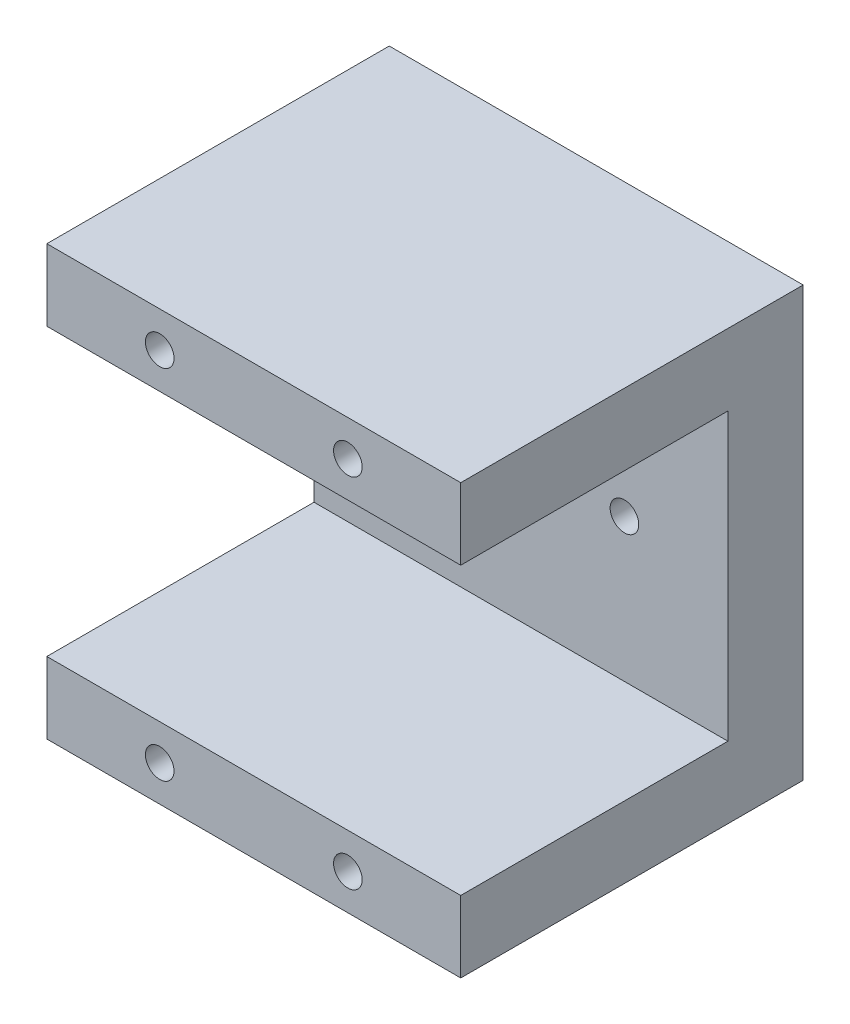
ISO-10303-21;
HEADER;
FILE_DESCRIPTION(('STEP AP214'),'2;1');
FILE_NAME('part.step','',(''),(''),'','','');
FILE_SCHEMA(('AUTOMOTIVE_DESIGN { 1 0 10303 214 1 1 1 1 }'));
ENDSEC;
DATA;
#1=APPLICATION_CONTEXT('core data for automotive mechanical design processes');
#2=APPLICATION_PROTOCOL_DEFINITION('international standard','automotive_design',2000,#1);
#3=PRODUCT_CONTEXT('',#1,'mechanical');
#4=PRODUCT('Part','Part','',(#3));
#5=PRODUCT_RELATED_PRODUCT_CATEGORY('part','',(#4));
#6=PRODUCT_DEFINITION_FORMATION('','',#4);
#7=PRODUCT_DEFINITION_CONTEXT('part definition',#1,'design');
#8=PRODUCT_DEFINITION('design','',#6,#7);
#9=PRODUCT_DEFINITION_SHAPE('','',#8);
#10=(LENGTH_UNIT() NAMED_UNIT(*) SI_UNIT(.MILLI.,.METRE.));
#11=(NAMED_UNIT(*) PLANE_ANGLE_UNIT() SI_UNIT($,.RADIAN.));
#12=(NAMED_UNIT(*) SI_UNIT($,.STERADIAN.) SOLID_ANGLE_UNIT());
#13=UNCERTAINTY_MEASURE_WITH_UNIT(LENGTH_MEASURE(1.E-05),#10,'distance_accuracy_value','');
#14=(GEOMETRIC_REPRESENTATION_CONTEXT(3) GLOBAL_UNCERTAINTY_ASSIGNED_CONTEXT((#13)) GLOBAL_UNIT_ASSIGNED_CONTEXT((#10,
#11,#12)) REPRESENTATION_CONTEXT('',''));
#15=CARTESIAN_POINT('',(0.,0.,0.));
#16=DIRECTION('',(0.,0.,1.));
#17=DIRECTION('',(1.,0.,0.));
#18=AXIS2_PLACEMENT_3D('',#15,#16,#17);
#19=CARTESIAN_POINT('',(0.,0.,45.5));
#20=DIRECTION('',(0.,0.,1.));
#21=DIRECTION('',(1.,0.,0.));
#22=AXIS2_PLACEMENT_3D('',#19,#20,#21);
#23=PLANE('',#22);
#24=CARTESIAN_POINT('',(12.5,23.75,45.5));
#25=DIRECTION('',(0.,0.,1.));
#26=DIRECTION('',(1.,0.,0.));
#27=AXIS2_PLACEMENT_3D('',#24,#25,#26);
#28=CIRCLE('',#27,1.9);
#29=CARTESIAN_POINT('',(14.4,23.75,45.5));
#30=VERTEX_POINT('',#29);
#31=EDGE_CURVE('E406',#30,#30,#28,.T.);
#32=ORIENTED_EDGE('',*,*,#31,.F.);
#33=EDGE_LOOP('',(#32));
#34=FACE_BOUND('',#33,.T.);
#35=CARTESIAN_POINT('',(-12.5,23.75,45.5));
#36=DIRECTION('',(0.,0.,1.));
#37=DIRECTION('',(1.,0.,0.));
#38=AXIS2_PLACEMENT_3D('',#35,#36,#37);
#39=CIRCLE('',#38,1.9);
#40=CARTESIAN_POINT('',(-10.6,23.75,45.5));
#41=VERTEX_POINT('',#40);
#42=EDGE_CURVE('E410',#41,#41,#39,.T.);
#43=ORIENTED_EDGE('',*,*,#42,.F.);
#44=EDGE_LOOP('',(#43));
#45=FACE_BOUND('',#44,.T.);
#46=DIRECTION('',(-1.,0.,0.));
#47=VECTOR('',#46,1.);
#48=CARTESIAN_POINT('',(-27.5,19.,45.5));
#49=LINE('',#48,#47);
#50=CARTESIAN_POINT('',(27.5,19.,45.5));
#51=VERTEX_POINT('',#50);
#52=CARTESIAN_POINT('',(-27.5,19.,45.5));
#53=VERTEX_POINT('',#52);
#54=EDGE_CURVE('E128',#51,#53,#49,.T.);
#55=ORIENTED_EDGE('',*,*,#54,.F.);
#56=DIRECTION('',(0.,1.,0.));
#57=VECTOR('',#56,1.);
#58=CARTESIAN_POINT('',(27.5,28.5,45.5));
#59=LINE('',#58,#57);
#60=CARTESIAN_POINT('',(27.5,28.5,45.5));
#61=VERTEX_POINT('',#60);
#62=EDGE_CURVE('E90',#51,#61,#59,.T.);
#63=ORIENTED_EDGE('',*,*,#62,.T.);
#64=DIRECTION('',(-1.,0.,0.));
#65=VECTOR('',#64,1.);
#66=CARTESIAN_POINT('',(-27.5,28.5,45.5));
#67=LINE('',#66,#65);
#68=CARTESIAN_POINT('',(-27.5,28.5,45.5));
#69=VERTEX_POINT('',#68);
#70=EDGE_CURVE('E142',#61,#69,#67,.T.);
#71=ORIENTED_EDGE('',*,*,#70,.T.);
#72=DIRECTION('',(0.,-1.,0.));
#73=VECTOR('',#72,1.);
#74=CARTESIAN_POINT('',(-27.5,28.5,45.5));
#75=LINE('',#74,#73);
#76=EDGE_CURVE('E144',#69,#53,#75,.T.);
#77=ORIENTED_EDGE('',*,*,#76,.T.);
#78=EDGE_LOOP('',(#55,#63,#71,#77));
#79=FACE_BOUND('',#78,.T.);
#80=ADVANCED_FACE('F37',(#34,#45,#79),#23,.T.);
#81=CARTESIAN_POINT('',(27.5,28.5,45.5));
#82=DIRECTION('',(-1.,0.,0.));
#83=DIRECTION('',(0.,-1.,0.));
#84=AXIS2_PLACEMENT_3D('',#81,#82,#83);
#85=PLANE('',#84);
#86=ORIENTED_EDGE('',*,*,#62,.F.);
#87=DIRECTION('',(0.,0.,1.));
#88=VECTOR('',#87,1.);
#89=CARTESIAN_POINT('',(27.5,19.,10.));
#90=LINE('',#89,#88);
#91=CARTESIAN_POINT('',(27.5,19.,10.));
#92=VERTEX_POINT('',#91);
#93=EDGE_CURVE('E135',#92,#51,#90,.T.);
#94=ORIENTED_EDGE('',*,*,#93,.F.);
#95=DIRECTION('',(0.,1.,0.));
#96=VECTOR('',#95,1.);
#97=CARTESIAN_POINT('',(27.5,19.,10.));
#98=LINE('',#97,#96);
#99=CARTESIAN_POINT('',(27.5,-19.,10.));
#100=VERTEX_POINT('',#99);
#101=EDGE_CURVE('E118',#100,#92,#98,.T.);
#102=ORIENTED_EDGE('',*,*,#101,.F.);
#103=DIRECTION('',(0.,0.,1.));
#104=VECTOR('',#103,1.);
#105=CARTESIAN_POINT('',(27.5,-19.,10.));
#106=LINE('',#105,#104);
#107=CARTESIAN_POINT('',(27.5,-19.,45.5));
#108=VERTEX_POINT('',#107);
#109=EDGE_CURVE('E115',#100,#108,#106,.T.);
#110=ORIENTED_EDGE('',*,*,#109,.T.);
#111=CARTESIAN_POINT('',(27.5,-28.5,45.5));
#112=VERTEX_POINT('',#111);
#113=EDGE_CURVE('E140',#112,#108,#59,.T.);
#114=ORIENTED_EDGE('',*,*,#113,.F.);
#115=DIRECTION('',(0.,0.,-1.));
#116=VECTOR('',#115,1.);
#117=CARTESIAN_POINT('',(27.5,-28.5,45.5));
#118=LINE('',#117,#116);
#119=CARTESIAN_POINT('',(27.5,-28.5,0.));
#120=VERTEX_POINT('',#119);
#121=EDGE_CURVE('E148',#112,#120,#118,.T.);
#122=ORIENTED_EDGE('',*,*,#121,.T.);
#123=DIRECTION('',(0.,1.,0.));
#124=VECTOR('',#123,1.);
#125=CARTESIAN_POINT('',(27.5,28.5,0.));
#126=LINE('',#125,#124);
#127=CARTESIAN_POINT('',(27.5,28.5,0.));
#128=VERTEX_POINT('',#127);
#129=EDGE_CURVE('E149',#120,#128,#126,.T.);
#130=ORIENTED_EDGE('',*,*,#129,.T.);
#131=DIRECTION('',(0.,0.,-1.));
#132=VECTOR('',#131,1.);
#133=CARTESIAN_POINT('',(27.5,28.5,45.5));
#134=LINE('',#133,#132);
#135=EDGE_CURVE('E11',#61,#128,#134,.T.);
#136=ORIENTED_EDGE('',*,*,#135,.F.);
#137=EDGE_LOOP('',(#86,#94,#102,#110,#114,#122,#130,#136));
#138=FACE_BOUND('',#137,.T.);
#139=ADVANCED_FACE('F39',(#138),#85,.F.);
#140=CARTESIAN_POINT('',(-27.5,28.5,45.5));
#141=DIRECTION('',(0.,-1.,0.));
#142=DIRECTION('',(0.,0.,-1.));
#143=AXIS2_PLACEMENT_3D('',#140,#141,#142);
#144=PLANE('',#143);
#145=DIRECTION('',(-1.,0.,0.));
#146=VECTOR('',#145,1.);
#147=CARTESIAN_POINT('',(-27.5,28.5,0.));
#148=LINE('',#147,#146);
#149=CARTESIAN_POINT('',(-27.5,28.5,0.));
#150=VERTEX_POINT('',#149);
#151=EDGE_CURVE('E152',#128,#150,#148,.T.);
#152=ORIENTED_EDGE('',*,*,#151,.T.);
#153=DIRECTION('',(0.,0.,-1.));
#154=VECTOR('',#153,1.);
#155=CARTESIAN_POINT('',(-27.5,28.5,45.5));
#156=LINE('',#155,#154);
#157=EDGE_CURVE('E45',#69,#150,#156,.T.);
#158=ORIENTED_EDGE('',*,*,#157,.F.);
#159=ORIENTED_EDGE('',*,*,#70,.F.);
#160=ORIENTED_EDGE('',*,*,#135,.T.);
#161=EDGE_LOOP('',(#152,#158,#159,#160));
#162=FACE_BOUND('',#161,.T.);
#163=ADVANCED_FACE('F181',(#162),#144,.F.);
#164=CARTESIAN_POINT('',(-27.5,28.5,45.5));
#165=DIRECTION('',(1.,0.,0.));
#166=DIRECTION('',(0.,1.,0.));
#167=AXIS2_PLACEMENT_3D('',#164,#165,#166);
#168=PLANE('',#167);
#169=DIRECTION('',(0.,-1.,0.));
#170=VECTOR('',#169,1.);
#171=CARTESIAN_POINT('',(-27.5,-19.,10.));
#172=LINE('',#171,#170);
#173=CARTESIAN_POINT('',(-27.5,19.,10.));
#174=VERTEX_POINT('',#173);
#175=CARTESIAN_POINT('',(-27.5,-19.,10.));
#176=VERTEX_POINT('',#175);
#177=EDGE_CURVE('E119',#174,#176,#172,.T.);
#178=ORIENTED_EDGE('',*,*,#177,.F.);
#179=DIRECTION('',(0.,0.,1.));
#180=VECTOR('',#179,1.);
#181=CARTESIAN_POINT('',(-27.5,19.,10.));
#182=LINE('',#181,#180);
#183=EDGE_CURVE('E153',#174,#53,#182,.T.);
#184=ORIENTED_EDGE('',*,*,#183,.T.);
#185=ORIENTED_EDGE('',*,*,#76,.F.);
#186=ORIENTED_EDGE('',*,*,#157,.T.);
#187=DIRECTION('',(0.,-1.,0.));
#188=VECTOR('',#187,1.);
#189=CARTESIAN_POINT('',(-27.5,28.5,0.));
#190=LINE('',#189,#188);
#191=CARTESIAN_POINT('',(-27.5,-28.5,0.));
#192=VERTEX_POINT('',#191);
#193=EDGE_CURVE('E155',#150,#192,#190,.T.);
#194=ORIENTED_EDGE('',*,*,#193,.T.);
#195=DIRECTION('',(0.,0.,-1.));
#196=VECTOR('',#195,1.);
#197=CARTESIAN_POINT('',(-27.5,-28.5,45.5));
#198=LINE('',#197,#196);
#199=CARTESIAN_POINT('',(-27.5,-28.5,45.5));
#200=VERTEX_POINT('',#199);
#201=EDGE_CURVE('E159',#200,#192,#198,.T.);
#202=ORIENTED_EDGE('',*,*,#201,.F.);
#203=CARTESIAN_POINT('',(-27.5,-19.,45.5));
#204=VERTEX_POINT('',#203);
#205=EDGE_CURVE('E133',#204,#200,#75,.T.);
#206=ORIENTED_EDGE('',*,*,#205,.F.);
#207=DIRECTION('',(0.,0.,1.));
#208=VECTOR('',#207,1.);
#209=CARTESIAN_POINT('',(-27.5,-19.,10.));
#210=LINE('',#209,#208);
#211=EDGE_CURVE('E52',#176,#204,#210,.T.);
#212=ORIENTED_EDGE('',*,*,#211,.F.);
#213=EDGE_LOOP('',(#178,#184,#185,#186,#194,#202,#206,#212));
#214=FACE_BOUND('',#213,.T.);
#215=ADVANCED_FACE('F131',(#214),#168,.F.);
#216=CARTESIAN_POINT('',(-27.5,-28.5,45.5));
#217=DIRECTION('',(0.,1.,0.));
#218=DIRECTION('',(0.,0.,1.));
#219=AXIS2_PLACEMENT_3D('',#216,#217,#218);
#220=PLANE('',#219);
#221=DIRECTION('',(1.,0.,0.));
#222=VECTOR('',#221,1.);
#223=CARTESIAN_POINT('',(-27.5,-28.5,0.));
#224=LINE('',#223,#222);
#225=EDGE_CURVE('E82',#192,#120,#224,.T.);
#226=ORIENTED_EDGE('',*,*,#225,.T.);
#227=ORIENTED_EDGE('',*,*,#121,.F.);
#228=DIRECTION('',(1.,0.,0.));
#229=VECTOR('',#228,1.);
#230=CARTESIAN_POINT('',(-27.5,-28.5,45.5));
#231=LINE('',#230,#229);
#232=EDGE_CURVE('E61',#200,#112,#231,.T.);
#233=ORIENTED_EDGE('',*,*,#232,.F.);
#234=ORIENTED_EDGE('',*,*,#201,.T.);
#235=EDGE_LOOP('',(#226,#227,#233,#234));
#236=FACE_BOUND('',#235,.T.);
#237=ADVANCED_FACE('F171',(#236),#220,.F.);
#238=CARTESIAN_POINT('',(-12.5,-23.75,45.5));
#239=DIRECTION('',(0.,0.,1.));
#240=DIRECTION('',(1.,0.,0.));
#241=AXIS2_PLACEMENT_3D('',#238,#239,#240);
#242=CIRCLE('',#241,1.9);
#243=CARTESIAN_POINT('',(-10.6,-23.75,45.5));
#244=VERTEX_POINT('',#243);
#245=EDGE_CURVE('E407',#244,#244,#242,.T.);
#246=ORIENTED_EDGE('',*,*,#245,.F.);
#247=EDGE_LOOP('',(#246));
#248=FACE_BOUND('',#247,.T.);
#249=CARTESIAN_POINT('',(12.5,-23.75,45.5));
#250=DIRECTION('',(0.,0.,1.));
#251=DIRECTION('',(1.,0.,0.));
#252=AXIS2_PLACEMENT_3D('',#249,#250,#251);
#253=CIRCLE('',#252,1.9);
#254=CARTESIAN_POINT('',(14.4,-23.75,45.5));
#255=VERTEX_POINT('',#254);
#256=EDGE_CURVE('E419',#255,#255,#253,.T.);
#257=ORIENTED_EDGE('',*,*,#256,.F.);
#258=EDGE_LOOP('',(#257));
#259=FACE_BOUND('',#258,.T.);
#260=DIRECTION('',(1.,0.,0.));
#261=VECTOR('',#260,1.);
#262=CARTESIAN_POINT('',(27.5,-19.,45.5));
#263=LINE('',#262,#261);
#264=EDGE_CURVE('E218',#204,#108,#263,.T.);
#265=ORIENTED_EDGE('',*,*,#264,.F.);
#266=ORIENTED_EDGE('',*,*,#205,.T.);
#267=ORIENTED_EDGE('',*,*,#232,.T.);
#268=ORIENTED_EDGE('',*,*,#113,.T.);
#269=EDGE_LOOP('',(#265,#266,#267,#268));
#270=FACE_BOUND('',#269,.T.);
#271=ADVANCED_FACE('F173',(#248,#259,#270),#23,.T.);
#272=CARTESIAN_POINT('',(0.,0.,0.));
#273=DIRECTION('',(0.,0.,1.));
#274=DIRECTION('',(1.,0.,0.));
#275=AXIS2_PLACEMENT_3D('',#272,#273,#274);
#276=PLANE('',#275);
#277=CARTESIAN_POINT('',(13.75,0.,0.));
#278=DIRECTION('',(0.,0.,-1.));
#279=DIRECTION('',(-1.,0.,0.));
#280=AXIS2_PLACEMENT_3D('',#277,#278,#279);
#281=CIRCLE('',#280,1.9);
#282=CARTESIAN_POINT('',(11.85,0.,0.));
#283=VERTEX_POINT('',#282);
#284=EDGE_CURVE('E203',#283,#283,#281,.T.);
#285=ORIENTED_EDGE('',*,*,#284,.F.);
#286=EDGE_LOOP('',(#285));
#287=FACE_BOUND('',#286,.T.);
#288=CARTESIAN_POINT('',(-13.75,0.,0.));
#289=DIRECTION('',(0.,0.,-1.));
#290=DIRECTION('',(-1.,0.,0.));
#291=AXIS2_PLACEMENT_3D('',#288,#289,#290);
#292=CIRCLE('',#291,1.9);
#293=CARTESIAN_POINT('',(-15.65,0.,0.));
#294=VERTEX_POINT('',#293);
#295=EDGE_CURVE('E206',#294,#294,#292,.T.);
#296=ORIENTED_EDGE('',*,*,#295,.F.);
#297=EDGE_LOOP('',(#296));
#298=FACE_BOUND('',#297,.T.);
#299=ORIENTED_EDGE('',*,*,#129,.F.);
#300=ORIENTED_EDGE('',*,*,#225,.F.);
#301=ORIENTED_EDGE('',*,*,#193,.F.);
#302=ORIENTED_EDGE('',*,*,#151,.F.);
#303=EDGE_LOOP('',(#299,#300,#301,#302));
#304=FACE_BOUND('',#303,.T.);
#305=ADVANCED_FACE('F167',(#287,#298,#304),#276,.F.);
#306=CARTESIAN_POINT('',(-27.5,19.,10.));
#307=DIRECTION('',(0.,1.,0.));
#308=DIRECTION('',(0.,0.,1.));
#309=AXIS2_PLACEMENT_3D('',#306,#307,#308);
#310=PLANE('',#309);
#311=ORIENTED_EDGE('',*,*,#54,.T.);
#312=ORIENTED_EDGE('',*,*,#183,.F.);
#313=DIRECTION('',(-1.,0.,0.));
#314=VECTOR('',#313,1.);
#315=CARTESIAN_POINT('',(-27.5,19.,10.));
#316=LINE('',#315,#314);
#317=EDGE_CURVE('E125',#92,#174,#316,.T.);
#318=ORIENTED_EDGE('',*,*,#317,.F.);
#319=ORIENTED_EDGE('',*,*,#93,.T.);
#320=EDGE_LOOP('',(#311,#312,#318,#319));
#321=FACE_BOUND('',#320,.T.);
#322=ADVANCED_FACE('F194',(#321),#310,.F.);
#323=CARTESIAN_POINT('',(27.5,-19.,10.));
#324=DIRECTION('',(0.,-1.,0.));
#325=DIRECTION('',(1.,0.,0.));
#326=AXIS2_PLACEMENT_3D('',#323,#324,#325);
#327=PLANE('',#326);
#328=ORIENTED_EDGE('',*,*,#264,.T.);
#329=ORIENTED_EDGE('',*,*,#109,.F.);
#330=DIRECTION('',(1.,0.,0.));
#331=VECTOR('',#330,1.);
#332=CARTESIAN_POINT('',(27.5,-19.,10.));
#333=LINE('',#332,#331);
#334=EDGE_CURVE('E111',#176,#100,#333,.T.);
#335=ORIENTED_EDGE('',*,*,#334,.F.);
#336=ORIENTED_EDGE('',*,*,#211,.T.);
#337=EDGE_LOOP('',(#328,#329,#335,#336));
#338=FACE_BOUND('',#337,.T.);
#339=ADVANCED_FACE('F113',(#338),#327,.F.);
#340=CARTESIAN_POINT('',(0.,0.,10.));
#341=DIRECTION('',(0.,0.,-1.));
#342=DIRECTION('',(-1.,0.,0.));
#343=AXIS2_PLACEMENT_3D('',#340,#341,#342);
#344=PLANE('',#343);
#345=CARTESIAN_POINT('',(13.75,0.,10.));
#346=DIRECTION('',(0.,0.,-1.));
#347=DIRECTION('',(-1.,0.,0.));
#348=AXIS2_PLACEMENT_3D('',#345,#346,#347);
#349=CIRCLE('',#348,1.9);
#350=CARTESIAN_POINT('',(11.85,0.,10.));
#351=VERTEX_POINT('',#350);
#352=EDGE_CURVE('E210',#351,#351,#349,.T.);
#353=ORIENTED_EDGE('',*,*,#352,.T.);
#354=EDGE_LOOP('',(#353));
#355=FACE_BOUND('',#354,.T.);
#356=CARTESIAN_POINT('',(-13.75,0.,10.));
#357=DIRECTION('',(0.,0.,-1.));
#358=DIRECTION('',(-1.,0.,0.));
#359=AXIS2_PLACEMENT_3D('',#356,#357,#358);
#360=CIRCLE('',#359,1.9);
#361=CARTESIAN_POINT('',(-15.65,0.,10.));
#362=VERTEX_POINT('',#361);
#363=EDGE_CURVE('E208',#362,#362,#360,.T.);
#364=ORIENTED_EDGE('',*,*,#363,.T.);
#365=EDGE_LOOP('',(#364));
#366=FACE_BOUND('',#365,.T.);
#367=ORIENTED_EDGE('',*,*,#177,.T.);
#368=ORIENTED_EDGE('',*,*,#334,.T.);
#369=ORIENTED_EDGE('',*,*,#101,.T.);
#370=ORIENTED_EDGE('',*,*,#317,.T.);
#371=EDGE_LOOP('',(#367,#368,#369,#370));
#372=FACE_BOUND('',#371,.T.);
#373=ADVANCED_FACE('F123',(#355,#366,#372),#344,.F.);
#374=CARTESIAN_POINT('',(-13.75,0.,10.));
#375=DIRECTION('',(0.,0.,-1.));
#376=DIRECTION('',(-1.,0.,0.));
#377=AXIS2_PLACEMENT_3D('',#374,#375,#376);
#378=CYLINDRICAL_SURFACE('',#377,1.9);
#379=ORIENTED_EDGE('',*,*,#363,.F.);
#380=EDGE_LOOP('',(#379));
#381=FACE_BOUND('',#380,.T.);
#382=ORIENTED_EDGE('',*,*,#295,.T.);
#383=EDGE_LOOP('',(#382));
#384=FACE_BOUND('',#383,.T.);
#385=ADVANCED_FACE('F266',(#381,#384),#378,.F.);
#386=CARTESIAN_POINT('',(13.75,0.,10.));
#387=DIRECTION('',(0.,0.,-1.));
#388=DIRECTION('',(-1.,0.,0.));
#389=AXIS2_PLACEMENT_3D('',#386,#387,#388);
#390=CYLINDRICAL_SURFACE('',#389,1.9);
#391=ORIENTED_EDGE('',*,*,#352,.F.);
#392=EDGE_LOOP('',(#391));
#393=FACE_BOUND('',#392,.T.);
#394=ORIENTED_EDGE('',*,*,#284,.T.);
#395=EDGE_LOOP('',(#394));
#396=FACE_BOUND('',#395,.T.);
#397=ADVANCED_FACE('F277',(#393,#396),#390,.F.);
#398=CARTESIAN_POINT('',(12.5,-23.75,25.5));
#399=DIRECTION('',(0.,0.,1.));
#400=DIRECTION('',(1.,0.,0.));
#401=AXIS2_PLACEMENT_3D('',#398,#399,#400);
#402=CYLINDRICAL_SURFACE('',#401,1.9);
#403=CARTESIAN_POINT('',(12.5,-23.75,25.5));
#404=DIRECTION('',(0.,0.,1.));
#405=DIRECTION('',(1.,0.,0.));
#406=AXIS2_PLACEMENT_3D('',#403,#404,#405);
#407=CIRCLE('',#406,1.9);
#408=CARTESIAN_POINT('',(14.4,-23.75,25.5));
#409=VERTEX_POINT('',#408);
#410=EDGE_CURVE('E433',#409,#409,#407,.T.);
#411=ORIENTED_EDGE('',*,*,#410,.F.);
#412=EDGE_LOOP('',(#411));
#413=FACE_BOUND('',#412,.T.);
#414=ORIENTED_EDGE('',*,*,#256,.T.);
#415=EDGE_LOOP('',(#414));
#416=FACE_BOUND('',#415,.T.);
#417=ADVANCED_FACE('F287',(#413,#416),#402,.F.);
#418=CARTESIAN_POINT('',(12.5,-23.75,25.5));
#419=DIRECTION('',(0.,0.,1.));
#420=DIRECTION('',(1.,0.,0.));
#421=AXIS2_PLACEMENT_3D('',#418,#419,#420);
#422=PLANE('',#421);
#423=ORIENTED_EDGE('',*,*,#410,.T.);
#424=EDGE_LOOP('',(#423));
#425=FACE_BOUND('',#424,.T.);
#426=ADVANCED_FACE('F308',(#425),#422,.T.);
#427=CARTESIAN_POINT('',(-12.5,-23.75,25.5));
#428=DIRECTION('',(0.,0.,1.));
#429=DIRECTION('',(1.,0.,0.));
#430=AXIS2_PLACEMENT_3D('',#427,#428,#429);
#431=CYLINDRICAL_SURFACE('',#430,1.9);
#432=CARTESIAN_POINT('',(-12.5,-23.75,25.5));
#433=DIRECTION('',(0.,0.,1.));
#434=DIRECTION('',(1.,0.,0.));
#435=AXIS2_PLACEMENT_3D('',#432,#433,#434);
#436=CIRCLE('',#435,1.9);
#437=CARTESIAN_POINT('',(-10.6,-23.75,25.5));
#438=VERTEX_POINT('',#437);
#439=EDGE_CURVE('E413',#438,#438,#436,.T.);
#440=ORIENTED_EDGE('',*,*,#439,.F.);
#441=EDGE_LOOP('',(#440));
#442=FACE_BOUND('',#441,.T.);
#443=ORIENTED_EDGE('',*,*,#245,.T.);
#444=EDGE_LOOP('',(#443));
#445=FACE_BOUND('',#444,.T.);
#446=ADVANCED_FACE('F319',(#442,#445),#431,.F.);
#447=CARTESIAN_POINT('',(-12.5,-23.75,25.5));
#448=DIRECTION('',(0.,0.,1.));
#449=DIRECTION('',(1.,0.,0.));
#450=AXIS2_PLACEMENT_3D('',#447,#448,#449);
#451=PLANE('',#450);
#452=ORIENTED_EDGE('',*,*,#439,.T.);
#453=EDGE_LOOP('',(#452));
#454=FACE_BOUND('',#453,.T.);
#455=ADVANCED_FACE('F330',(#454),#451,.T.);
#456=CARTESIAN_POINT('',(-12.5,23.75,25.5));
#457=DIRECTION('',(0.,0.,1.));
#458=DIRECTION('',(1.,0.,0.));
#459=AXIS2_PLACEMENT_3D('',#456,#457,#458);
#460=CYLINDRICAL_SURFACE('',#459,1.9);
#461=CARTESIAN_POINT('',(-12.5,23.75,25.5));
#462=DIRECTION('',(0.,0.,1.));
#463=DIRECTION('',(1.,0.,0.));
#464=AXIS2_PLACEMENT_3D('',#461,#462,#463);
#465=CIRCLE('',#464,1.9);
#466=CARTESIAN_POINT('',(-10.6,23.75,25.5));
#467=VERTEX_POINT('',#466);
#468=EDGE_CURVE('E213',#467,#467,#465,.T.);
#469=ORIENTED_EDGE('',*,*,#468,.F.);
#470=EDGE_LOOP('',(#469));
#471=FACE_BOUND('',#470,.T.);
#472=ORIENTED_EDGE('',*,*,#42,.T.);
#473=EDGE_LOOP('',(#472));
#474=FACE_BOUND('',#473,.T.);
#475=ADVANCED_FACE('F341',(#471,#474),#460,.F.);
#476=CARTESIAN_POINT('',(-12.5,23.75,25.5));
#477=DIRECTION('',(0.,0.,1.));
#478=DIRECTION('',(1.,0.,0.));
#479=AXIS2_PLACEMENT_3D('',#476,#477,#478);
#480=PLANE('',#479);
#481=ORIENTED_EDGE('',*,*,#468,.T.);
#482=EDGE_LOOP('',(#481));
#483=FACE_BOUND('',#482,.T.);
#484=ADVANCED_FACE('F352',(#483),#480,.T.);
#485=CARTESIAN_POINT('',(12.5,23.75,25.5));
#486=DIRECTION('',(0.,0.,1.));
#487=DIRECTION('',(1.,0.,0.));
#488=AXIS2_PLACEMENT_3D('',#485,#486,#487);
#489=CYLINDRICAL_SURFACE('',#488,1.9);
#490=CARTESIAN_POINT('',(12.5,23.75,25.5));
#491=DIRECTION('',(0.,0.,1.));
#492=DIRECTION('',(1.,0.,0.));
#493=AXIS2_PLACEMENT_3D('',#490,#491,#492);
#494=CIRCLE('',#493,1.9);
#495=CARTESIAN_POINT('',(14.4,23.75,25.5));
#496=VERTEX_POINT('',#495);
#497=EDGE_CURVE('E405',#496,#496,#494,.T.);
#498=ORIENTED_EDGE('',*,*,#497,.F.);
#499=EDGE_LOOP('',(#498));
#500=FACE_BOUND('',#499,.T.);
#501=ORIENTED_EDGE('',*,*,#31,.T.);
#502=EDGE_LOOP('',(#501));
#503=FACE_BOUND('',#502,.T.);
#504=ADVANCED_FACE('F363',(#500,#503),#489,.F.);
#505=CARTESIAN_POINT('',(12.5,23.75,25.5));
#506=DIRECTION('',(0.,0.,1.));
#507=DIRECTION('',(1.,0.,0.));
#508=AXIS2_PLACEMENT_3D('',#505,#506,#507);
#509=PLANE('',#508);
#510=ORIENTED_EDGE('',*,*,#497,.T.);
#511=EDGE_LOOP('',(#510));
#512=FACE_BOUND('',#511,.T.);
#513=ADVANCED_FACE('F374',(#512),#509,.T.);
#514=CLOSED_SHELL('',(#80,#139,#163,#215,#237,#271,#305,#322,#339,#373,#385,#397,#417,#426,#446,
#455,#475,#484,#504,#513));
#515=MANIFOLD_SOLID_BREP('B2',#514);
#516=ADVANCED_BREP_SHAPE_REPRESENTATION('',(#18,#515),#14);
#517=SHAPE_DEFINITION_REPRESENTATION(#9,#516);
ENDSEC;
END-ISO-10303-21;
